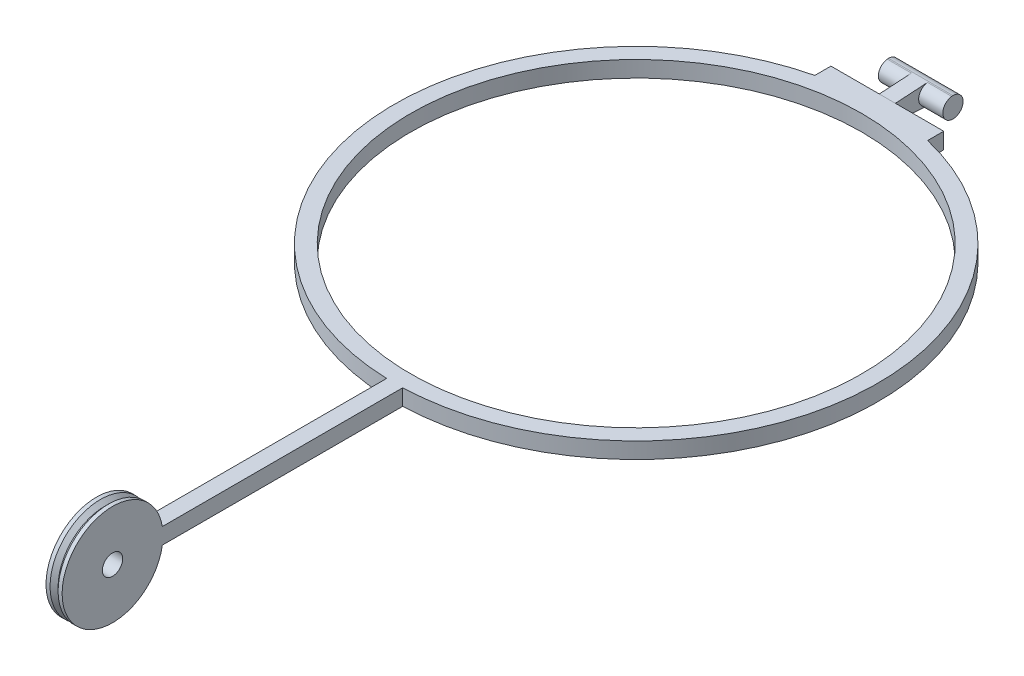
ISO-10303-21;
HEADER;
FILE_DESCRIPTION(('STEP AP214'),'2;1');
FILE_NAME('part.step','',(''),(''),'','','');
FILE_SCHEMA(('AUTOMOTIVE_DESIGN { 1 0 10303 214 1 1 1 1 }'));
ENDSEC;
DATA;
#1=APPLICATION_CONTEXT('core data for automotive mechanical design processes');
#2=APPLICATION_PROTOCOL_DEFINITION('international standard','automotive_design',2000,#1);
#3=PRODUCT_CONTEXT('',#1,'mechanical');
#4=PRODUCT('Part','Part','',(#3));
#5=PRODUCT_RELATED_PRODUCT_CATEGORY('part','',(#4));
#6=PRODUCT_DEFINITION_FORMATION('','',#4);
#7=PRODUCT_DEFINITION_CONTEXT('part definition',#1,'design');
#8=PRODUCT_DEFINITION('design','',#6,#7);
#9=PRODUCT_DEFINITION_SHAPE('','',#8);
#10=(LENGTH_UNIT() NAMED_UNIT(*) SI_UNIT(.MILLI.,.METRE.));
#11=(NAMED_UNIT(*) PLANE_ANGLE_UNIT() SI_UNIT($,.RADIAN.));
#12=(NAMED_UNIT(*) SI_UNIT($,.STERADIAN.) SOLID_ANGLE_UNIT());
#13=UNCERTAINTY_MEASURE_WITH_UNIT(LENGTH_MEASURE(1.E-05),#10,'distance_accuracy_value','');
#14=(GEOMETRIC_REPRESENTATION_CONTEXT(3) GLOBAL_UNCERTAINTY_ASSIGNED_CONTEXT((#13)) GLOBAL_UNIT_ASSIGNED_CONTEXT((#10,
#11,#12)) REPRESENTATION_CONTEXT('',''));
#15=CARTESIAN_POINT('',(0.,0.,0.));
#16=DIRECTION('',(0.,0.,1.));
#17=DIRECTION('',(1.,0.,0.));
#18=AXIS2_PLACEMENT_3D('',#15,#16,#17);
#19=CARTESIAN_POINT('',(0.,3.175,-308.520796125924));
#20=DIRECTION('',(0.,0.,-1.));
#21=DIRECTION('',(0.,1.,0.));
#22=AXIS2_PLACEMENT_3D('',#19,#20,#21);
#23=PLANE('',#22);
#24=DIRECTION('',(1.,0.,0.));
#25=VECTOR('',#24,1.);
#26=CARTESIAN_POINT('',(0.,3.175,-308.520796125924));
#27=LINE('',#26,#25);
#28=CARTESIAN_POINT('',(-19.05,3.175,-308.520796125924));
#29=VERTEX_POINT('',#28);
#30=CARTESIAN_POINT('',(0.,3.175,-308.520796125924));
#31=VERTEX_POINT('',#30);
#32=EDGE_CURVE('E253',#29,#31,#27,.T.);
#33=ORIENTED_EDGE('',*,*,#32,.T.);
#34=DIRECTION('',(0.,-1.,0.));
#35=VECTOR('',#34,1.);
#36=CARTESIAN_POINT('',(0.,0.,-308.520796125924));
#37=LINE('',#36,#35);
#38=CARTESIAN_POINT('',(0.,-3.175,-308.520796125924));
#39=VERTEX_POINT('',#38);
#40=EDGE_CURVE('E227',#31,#39,#37,.T.);
#41=ORIENTED_EDGE('',*,*,#40,.T.);
#42=DIRECTION('',(1.,0.,0.));
#43=VECTOR('',#42,1.);
#44=CARTESIAN_POINT('',(0.,-3.175,-308.520796125924));
#45=LINE('',#44,#43);
#46=CARTESIAN_POINT('',(-19.05,-3.175,-308.520796125924));
#47=VERTEX_POINT('',#46);
#48=EDGE_CURVE('E272',#47,#39,#45,.T.);
#49=ORIENTED_EDGE('',*,*,#48,.F.);
#50=DIRECTION('',(0.,-1.,0.));
#51=VECTOR('',#50,1.);
#52=CARTESIAN_POINT('',(-19.05,3.175,-308.520796125924));
#53=LINE('',#52,#51);
#54=EDGE_CURVE('E291',#29,#47,#53,.T.);
#55=ORIENTED_EDGE('',*,*,#54,.F.);
#56=EDGE_LOOP('',(#33,#41,#49,#55));
#57=FACE_BOUND('',#56,.T.);
#58=ADVANCED_FACE('F41',(#57),#23,.T.);
#59=CARTESIAN_POINT('',(0.,4.,0.));
#60=DIRECTION('',(1.,0.,0.));
#61=DIRECTION('',(0.,0.,-1.));
#62=AXIS2_PLACEMENT_3D('',#59,#60,#61);
#63=PLANE('',#62);
#64=DIRECTION('',(0.,0.,-1.));
#65=VECTOR('',#64,1.);
#66=CARTESIAN_POINT('',(0.,3.175,-20.0280685851132));
#67=LINE('',#66,#65);
#68=CARTESIAN_POINT('',(0.,3.175,-20.0280685851132));
#69=VERTEX_POINT('',#68);
#70=CARTESIAN_POINT('',(0.,3.175,-114.352931373913));
#71=VERTEX_POINT('',#70);
#72=EDGE_CURVE('E300',#69,#71,#67,.T.);
#73=ORIENTED_EDGE('',*,*,#72,.T.);
#74=DIRECTION('',(0.,-1.,0.));
#75=VECTOR('',#74,1.);
#76=CARTESIAN_POINT('',(0.,3.175,-114.352931373913));
#77=LINE('',#76,#75);
#78=CARTESIAN_POINT('',(0.,-3.175,-114.352931373913));
#79=VERTEX_POINT('',#78);
#80=EDGE_CURVE('E265',#71,#79,#77,.T.);
#81=ORIENTED_EDGE('',*,*,#80,.T.);
#82=DIRECTION('',(0.,0.,1.));
#83=VECTOR('',#82,1.);
#84=CARTESIAN_POINT('',(0.,-3.175,-20.0280685851132));
#85=LINE('',#84,#83);
#86=CARTESIAN_POINT('',(0.,-3.175,-20.0280685851132));
#87=VERTEX_POINT('',#86);
#88=EDGE_CURVE('E296',#79,#87,#85,.T.);
#89=ORIENTED_EDGE('',*,*,#88,.T.);
#90=CARTESIAN_POINT('',(0.,-5.715,-20.0280685851132));
#91=DIRECTION('',(1.,0.,0.));
#92=DIRECTION('',(0.,0.,-1.));
#93=AXIS2_PLACEMENT_3D('',#90,#91,#92);
#94=CIRCLE('',#93,2.54);
#95=CARTESIAN_POINT('',(0.,-3.20893847135261,-19.6142381673894));
#96=VERTEX_POINT('',#95);
#97=EDGE_CURVE('E299',#87,#96,#94,.T.);
#98=ORIENTED_EDGE('',*,*,#97,.T.);
#99=CARTESIAN_POINT('',(0.,0.,0.));
#100=DIRECTION('',(-1.,0.,0.));
#101=DIRECTION('',(0.,0.,1.));
#102=AXIS2_PLACEMENT_3D('',#99,#100,#101);
#103=CIRCLE('',#102,19.875);
#104=CARTESIAN_POINT('',(0.,3.20893847135261,-19.6142381673894));
#105=VERTEX_POINT('',#104);
#106=EDGE_CURVE('E11',#96,#105,#103,.T.);
#107=ORIENTED_EDGE('',*,*,#106,.T.);
#108=CARTESIAN_POINT('',(0.,5.715,-20.0280685851132));
#109=DIRECTION('',(1.,0.,0.));
#110=DIRECTION('',(0.,0.,-1.));
#111=AXIS2_PLACEMENT_3D('',#108,#109,#110);
#112=CIRCLE('',#111,2.54);
#113=EDGE_CURVE('E302',#105,#69,#112,.T.);
#114=ORIENTED_EDGE('',*,*,#113,.T.);
#115=EDGE_LOOP('',(#73,#81,#89,#98,#107,#114));
#116=FACE_BOUND('',#115,.T.);
#117=CARTESIAN_POINT('',(0.,0.,0.));
#118=DIRECTION('',(-1.,0.,0.));
#119=DIRECTION('',(0.,0.,1.));
#120=AXIS2_PLACEMENT_3D('',#117,#118,#119);
#121=CIRCLE('',#120,4.);
#122=CARTESIAN_POINT('',(0.,0.,4.));
#123=VERTEX_POINT('',#122);
#124=EDGE_CURVE('E650',#123,#123,#121,.T.);
#125=ORIENTED_EDGE('',*,*,#124,.F.);
#126=EDGE_LOOP('',(#125));
#127=FACE_BOUND('',#126,.T.);
#128=ADVANCED_FACE('F43',(#116,#127),#63,.F.);
#129=CARTESIAN_POINT('',(0.,0.,0.));
#130=DIRECTION('',(-1.,0.,0.));
#131=DIRECTION('',(0.,0.,1.));
#132=AXIS2_PLACEMENT_3D('',#129,#130,#131);
#133=CYLINDRICAL_SURFACE('',#132,19.875);
#134=CARTESIAN_POINT('',(1.5875,0.,0.));
#135=DIRECTION('',(-1.,0.,0.));
#136=DIRECTION('',(0.,0.,1.));
#137=AXIS2_PLACEMENT_3D('',#134,#135,#136);
#138=CIRCLE('',#137,19.875);
#139=CARTESIAN_POINT('',(1.5875,-3.20893847135261,-19.6142381673894));
#140=VERTEX_POINT('',#139);
#141=CARTESIAN_POINT('',(1.5875,3.20893847135261,-19.6142381673894));
#142=VERTEX_POINT('',#141);
#143=EDGE_CURVE('E49',#140,#142,#138,.T.);
#144=ORIENTED_EDGE('',*,*,#143,.T.);
#145=DIRECTION('',(1.,0.,0.));
#146=VECTOR('',#145,1.);
#147=CARTESIAN_POINT('',(0.793749999999982,3.20893847135262,-19.6142381673893));
#148=LINE('',#147,#146);
#149=EDGE_CURVE('E652',#142,#105,#148,.F.);
#150=ORIENTED_EDGE('',*,*,#149,.T.);
#151=ORIENTED_EDGE('',*,*,#106,.F.);
#152=DIRECTION('',(1.,0.,0.));
#153=VECTOR('',#152,1.);
#154=CARTESIAN_POINT('',(3.17499999999998,-3.20893847135262,-19.6142381673893));
#155=LINE('',#154,#153);
#156=EDGE_CURVE('E467',#96,#140,#155,.T.);
#157=ORIENTED_EDGE('',*,*,#156,.T.);
#158=EDGE_LOOP('',(#144,#150,#151,#157));
#159=FACE_BOUND('',#158,.T.);
#160=ADVANCED_FACE('F373',(#159),#133,.T.);
#161=CARTESIAN_POINT('',(3.175,0.,0.));
#162=DIRECTION('',(-1.,0.,0.));
#163=DIRECTION('',(0.,0.,1.));
#164=AXIS2_PLACEMENT_3D('',#161,#162,#163);
#165=CONICAL_SURFACE('',#164,18.2875,0.785398163397448);
#166=CARTESIAN_POINT('',(3.175,0.,0.));
#167=DIRECTION('',(-1.,0.,0.));
#168=DIRECTION('',(0.,0.,1.));
#169=AXIS2_PLACEMENT_3D('',#166,#167,#168);
#170=CIRCLE('',#169,18.2875);
#171=CARTESIAN_POINT('',(3.175,-5.01803204897371,-17.5855625615296));
#172=VERTEX_POINT('',#171);
#173=CARTESIAN_POINT('',(3.175,5.01803204897371,-17.5855625615296));
#174=VERTEX_POINT('',#173);
#175=EDGE_CURVE('E640',#172,#174,#170,.T.);
#176=ORIENTED_EDGE('',*,*,#175,.T.);
#177=CARTESIAN_POINT('',(3.17499999030238,5.01823204897371,-17.585505500478));
#178=CARTESIAN_POINT('',(3.17502405515739,4.96513618649698,-17.6006356701795));
#179=CARTESIAN_POINT('',(3.17296089600134,4.91255559256466,-17.6175221345397));
#180=CARTESIAN_POINT('',(3.16480610051195,4.80892936765385,-17.6545397430293));
#181=CARTESIAN_POINT('',(3.15871865600897,4.75788219719122,-17.6746674944415));
#182=CARTESIAN_POINT('',(3.14274309919891,4.65822882268911,-17.7177103141274));
#183=CARTESIAN_POINT('',(3.13289462486999,4.60960294712521,-17.7405946638421));
#184=CARTESIAN_POINT('',(3.10964646107507,4.51457204950013,-17.7890017680711));
#185=CARTESIAN_POINT('',(3.09624605896725,4.46816747531848,-17.8145250514211));
#186=CARTESIAN_POINT('',(3.05126307810561,4.33304093969769,-17.8943677162299));
#187=CARTESIAN_POINT('',(3.0148181643232,4.24793131662126,-17.952168709759));
#188=CARTESIAN_POINT('',(2.93146283418181,4.08836313877495,-18.074652604436));
#189=CARTESIAN_POINT('',(2.88452632582482,4.0139319116988,-18.1393524491193));
#190=CARTESIAN_POINT('',(2.75767222998424,3.84203466522822,-18.3063975643941));
#191=CARTESIAN_POINT('',(2.67284229921008,3.75107146949168,-18.4116964341903));
#192=CARTESIAN_POINT('',(2.49109010255667,3.59090685984091,-18.6287352687228));
#193=CARTESIAN_POINT('',(2.39411912413202,3.52179730483181,-18.7405001457703));
#194=CARTESIAN_POINT('',(2.23767172921667,3.4301026851174,-18.9164017767731));
#195=CARTESIAN_POINT('',(2.18087601166023,3.40055014229437,-18.9794274730799));
#196=CARTESIAN_POINT('',(2.06535959967588,3.34719880562968,-19.1061957826569));
#197=CARTESIAN_POINT('',(2.00663835520765,3.32340167241029,-19.1699385973004));
#198=CARTESIAN_POINT('',(1.88841206153367,3.28154848838009,-19.297081015349));
#199=CARTESIAN_POINT('',(1.82892434681642,3.26342822324976,-19.3604758416092));
#200=CARTESIAN_POINT('',(1.70886171194385,3.23235412302284,-19.4873996966121));
#201=CARTESIAN_POINT('',(1.6482877646825,3.21939588453877,-19.5509285642997));
#202=CARTESIAN_POINT('',(1.5873,3.20890408587936,-19.614446451726));
#203=B_SPLINE_CURVE_WITH_KNOTS('',3,(#177,#178,#179,#180,#181,#182,#183,#184,#185,#186,#187,
#188,#189,#190,#191,#192,#193,#194,#195,#196,#197,#198,#199,#200,#201,#202),.UNSPECIFIED.,.F.,
.F.,(4,2,2,2,2,2,2,2,2,2,2,2,4),(0.,0.16553756777862,0.330902977201613,0.494571639970082,
0.658273165325804,0.984123147386781,1.31079269860429,1.7969984258337,2.28522149433629,
2.55456455237631,2.82398523215425,3.09023803031959,3.35626321675944),.UNSPECIFIED.);
#204=EDGE_CURVE('E469',#174,#142,#203,.T.);
#205=ORIENTED_EDGE('',*,*,#204,.T.);
#206=ORIENTED_EDGE('',*,*,#143,.F.);
#207=CARTESIAN_POINT('',(1.5873,-3.20890408587936,-19.614446451726));
#208=CARTESIAN_POINT('',(1.66064982255872,-3.22153110320836,-19.5380493496869));
#209=CARTESIAN_POINT('',(1.73341544587569,-3.2377170047899,-19.4616274158475));
#210=CARTESIAN_POINT('',(1.87735680631515,-3.27763445448927,-19.3089632312623));
#211=CARTESIAN_POINT('',(1.94852901729398,-3.30138124886678,-19.2327216598923));
#212=CARTESIAN_POINT('',(2.08942775207854,-3.35714382145323,-19.0800200198884));
#213=CARTESIAN_POINT('',(2.1591254139806,-3.38925846448253,-19.0035689605965));
#214=CARTESIAN_POINT('',(2.29528140739618,-3.46209781161551,-18.8520179020321));
#215=CARTESIAN_POINT('',(2.36174256784133,-3.50281482416876,-18.7769167604303));
#216=CARTESIAN_POINT('',(2.51043549991202,-3.6075253388356,-18.6057083746238));
#217=CARTESIAN_POINT('',(2.59118706302345,-3.67482300906941,-18.5102885579029));
#218=CARTESIAN_POINT('',(2.74217595977378,-3.82649561009981,-18.325310932763));
#219=CARTESIAN_POINT('',(2.81244950551055,-3.9108092375638,-18.2357335666822));
#220=CARTESIAN_POINT('',(2.92573787543575,-4.07879444820554,-18.0826607062241));
#221=CARTESIAN_POINT('',(2.97139237378838,-4.15918186846448,-18.0175438214527));
#222=CARTESIAN_POINT('',(3.05057098196331,-4.3312212360454,-17.8955062987592));
#223=CARTESIAN_POINT('',(3.08412423957324,-4.42284539409008,-17.8385661678185));
#224=CARTESIAN_POINT('',(3.13128251989571,-4.59699168588081,-17.7456609120086));
#225=CARTESIAN_POINT('',(3.14751177696336,-4.67776466006227,-17.7077727794117));
#226=CARTESIAN_POINT('',(3.16392090672709,-4.80272909923509,-17.6571177824549));
#227=CARTESIAN_POINT('',(3.16806858884479,-4.84517225548812,-17.6412179540781));
#228=CARTESIAN_POINT('',(3.1736139792659,-4.93103517639737,-17.6116526039692));
#229=CARTESIAN_POINT('',(3.17500995184232,-4.97445554000634,-17.5979884974679));
#230=CARTESIAN_POINT('',(3.17499999030238,-5.01823204897372,-17.585505500478));
#231=B_SPLINE_CURVE_WITH_KNOTS('',3,(#207,#208,#209,#210,#211,#212,#213,#214,#215,#216,#217,
#218,#219,#220,#221,#222,#223,#224,#225,#226,#227,#228,#229,#230),.UNSPECIFIED.,.F.,.F.,(4,2,2,
2,2,2,2,2,2,2,2,4),(0.,0.319970667702856,0.640590674709486,0.965185565257763,1.28949144808107,
1.714104534021,2.13721433282405,2.47519183204377,2.8123497337721,3.08325745561008,
3.21966259573286,3.35615375017256),.UNSPECIFIED.);
#232=EDGE_CURVE('E329',#140,#172,#231,.T.);
#233=ORIENTED_EDGE('',*,*,#232,.T.);
#234=EDGE_LOOP('',(#176,#205,#206,#233));
#235=FACE_BOUND('',#234,.T.);
#236=ADVANCED_FACE('F362',(#235),#165,.T.);
#237=CARTESIAN_POINT('',(4.7625,0.,0.));
#238=DIRECTION('',(1.,0.,0.));
#239=DIRECTION('',(0.,0.,-1.));
#240=AXIS2_PLACEMENT_3D('',#237,#238,#239);
#241=CONICAL_SURFACE('',#240,19.875,0.785398163397448);
#242=CARTESIAN_POINT('',(4.7625,0.,0.));
#243=DIRECTION('',(-1.,0.,0.));
#244=DIRECTION('',(0.,0.,1.));
#245=AXIS2_PLACEMENT_3D('',#242,#243,#244);
#246=CIRCLE('',#245,19.875);
#247=CARTESIAN_POINT('',(4.7625,-3.20893847135261,-19.6142381673894));
#248=VERTEX_POINT('',#247);
#249=CARTESIAN_POINT('',(4.7625,3.20893847135261,-19.6142381673894));
#250=VERTEX_POINT('',#249);
#251=EDGE_CURVE('E641',#248,#250,#246,.T.);
#252=ORIENTED_EDGE('',*,*,#251,.T.);
#253=CARTESIAN_POINT('',(4.7627,3.20890408587936,-19.614446451726));
#254=CARTESIAN_POINT('',(4.68935017744128,3.22153110320836,-19.5380493496868));
#255=CARTESIAN_POINT('',(4.61658455412431,3.2377170047899,-19.4616274158475));
#256=CARTESIAN_POINT('',(4.47264319368485,3.27763445448927,-19.3089632312623));
#257=CARTESIAN_POINT('',(4.40147098270601,3.30138124886678,-19.2327216598923));
#258=CARTESIAN_POINT('',(4.26057224792145,3.35714382145323,-19.0800200198884));
#259=CARTESIAN_POINT('',(4.19087458601939,3.38925846448253,-19.0035689605965));
#260=CARTESIAN_POINT('',(4.05471859260382,3.46209781161551,-18.8520179020321));
#261=CARTESIAN_POINT('',(3.98825743215867,3.50281482416876,-18.7769167604303));
#262=CARTESIAN_POINT('',(3.83956450008798,3.6075253388356,-18.6057083746238));
#263=CARTESIAN_POINT('',(3.75881293697655,3.67482300906941,-18.5102885579029));
#264=CARTESIAN_POINT('',(3.60782404022622,3.82649561009981,-18.325310932763));
#265=CARTESIAN_POINT('',(3.53755049448945,3.9108092375638,-18.2357335666822));
#266=CARTESIAN_POINT('',(3.42426212456425,4.07879444820554,-18.0826607062241));
#267=CARTESIAN_POINT('',(3.37860762621162,4.15918186846448,-18.0175438214527));
#268=CARTESIAN_POINT('',(3.29942901803669,4.3312212360454,-17.8955062987592));
#269=CARTESIAN_POINT('',(3.26587576042676,4.42284539409008,-17.8385661678185));
#270=CARTESIAN_POINT('',(3.21871748010429,4.59699168588081,-17.7456609120086));
#271=CARTESIAN_POINT('',(3.20248822303664,4.67776466006227,-17.7077727794117));
#272=CARTESIAN_POINT('',(3.18607909327291,4.80272909923508,-17.6571177824549));
#273=CARTESIAN_POINT('',(3.18193141115521,4.84517225548811,-17.6412179540781));
#274=CARTESIAN_POINT('',(3.1763860207341,4.93103517639736,-17.6116526039692));
#275=CARTESIAN_POINT('',(3.17499004815768,4.97445554000633,-17.5979884974679));
#276=CARTESIAN_POINT('',(3.17500000969762,5.01823204897371,-17.585505500478));
#277=B_SPLINE_CURVE_WITH_KNOTS('',3,(#253,#254,#255,#256,#257,#258,#259,#260,#261,#262,#263,
#264,#265,#266,#267,#268,#269,#270,#271,#272,#273,#274,#275,#276),.UNSPECIFIED.,.F.,.F.,(4,2,2,
2,2,2,2,2,2,2,2,4),(0.,0.31997066770286,0.640590674709487,0.965185565257763,1.28949144808107,
1.714104534021,2.13721433282405,2.47519183204377,2.8123497337721,3.08325745561007,
3.21966259573285,3.35615375017255),.UNSPECIFIED.);
#278=EDGE_CURVE('E464',#250,#174,#277,.T.);
#279=ORIENTED_EDGE('',*,*,#278,.T.);
#280=ORIENTED_EDGE('',*,*,#175,.F.);
#281=CARTESIAN_POINT('',(3.17500000969762,-5.01823204897372,-17.585505500478));
#282=CARTESIAN_POINT('',(3.17497594484261,-4.96513618649699,-17.6006356701795));
#283=CARTESIAN_POINT('',(3.17703910399866,-4.91255559256467,-17.6175221345397));
#284=CARTESIAN_POINT('',(3.18519389948805,-4.80892936765387,-17.6545397430293));
#285=CARTESIAN_POINT('',(3.19128134399103,-4.75788219719123,-17.6746674944415));
#286=CARTESIAN_POINT('',(3.20725690080108,-4.65822882268912,-17.7177103141274));
#287=CARTESIAN_POINT('',(3.21710537513,-4.60960294712522,-17.740594663842));
#288=CARTESIAN_POINT('',(3.24035353892493,-4.51457204950014,-17.7890017680711));
#289=CARTESIAN_POINT('',(3.25375394103275,-4.46816747531849,-17.8145250514211));
#290=CARTESIAN_POINT('',(3.29873692189438,-4.3330409396977,-17.8943677162299));
#291=CARTESIAN_POINT('',(3.33518183567679,-4.24793131662127,-17.952168709759));
#292=CARTESIAN_POINT('',(3.41853716581818,-4.08836313877497,-18.074652604436));
#293=CARTESIAN_POINT('',(3.46547367417518,-4.0139319116988,-18.1393524491192));
#294=CARTESIAN_POINT('',(3.59232777001575,-3.84203466522823,-18.3063975643941));
#295=CARTESIAN_POINT('',(3.67715770078991,-3.75107146949169,-18.4116964341902));
#296=CARTESIAN_POINT('',(3.85890989744331,-3.59090685984092,-18.6287352687228));
#297=CARTESIAN_POINT('',(3.95588087586797,-3.52179730483182,-18.7405001457702));
#298=CARTESIAN_POINT('',(4.11232827078332,-3.43010268511741,-18.916401776773));
#299=CARTESIAN_POINT('',(4.16912398833976,-3.40055014229437,-18.9794274730799));
#300=CARTESIAN_POINT('',(4.2846404003241,-3.34719880562969,-19.1061957826569));
#301=CARTESIAN_POINT('',(4.34336164479234,-3.3234016724103,-19.1699385973003));
#302=CARTESIAN_POINT('',(4.46158793846633,-3.28154848838009,-19.297081015349));
#303=CARTESIAN_POINT('',(4.52107565318358,-3.26342822324976,-19.3604758416092));
#304=CARTESIAN_POINT('',(4.64113828805615,-3.23235412302284,-19.4873996966121));
#305=CARTESIAN_POINT('',(4.7017122353175,-3.21939588453877,-19.5509285642997));
#306=CARTESIAN_POINT('',(4.7627,-3.20890408587936,-19.614446451726));
#307=B_SPLINE_CURVE_WITH_KNOTS('',3,(#281,#282,#283,#284,#285,#286,#287,#288,#289,#290,#291,
#292,#293,#294,#295,#296,#297,#298,#299,#300,#301,#302,#303,#304,#305,#306),.UNSPECIFIED.,.F.,
.F.,(4,2,2,2,2,2,2,2,2,2,2,2,4),(0.,0.165537567778618,0.330902977201611,0.494571639970078,
0.658273165325801,0.984123147386778,1.31079269860428,1.7969984258337,2.28522149433628,
2.5545645523763,2.82398523215425,3.0902380303196,3.35626321675945),.UNSPECIFIED.);
#308=EDGE_CURVE('E321',#172,#248,#307,.T.);
#309=ORIENTED_EDGE('',*,*,#308,.T.);
#310=EDGE_LOOP('',(#252,#279,#280,#309));
#311=FACE_BOUND('',#310,.T.);
#312=ADVANCED_FACE('F336',(#311),#241,.T.);
#313=CARTESIAN_POINT('',(0.,0.,0.));
#314=DIRECTION('',(-1.,0.,0.));
#315=DIRECTION('',(0.,0.,1.));
#316=AXIS2_PLACEMENT_3D('',#313,#314,#315);
#317=CYLINDRICAL_SURFACE('',#316,19.875);
#318=CARTESIAN_POINT('',(6.35,0.,0.));
#319=DIRECTION('',(-1.,0.,0.));
#320=DIRECTION('',(0.,0.,1.));
#321=AXIS2_PLACEMENT_3D('',#318,#319,#320);
#322=CIRCLE('',#321,19.875);
#323=CARTESIAN_POINT('',(6.35,-3.20893847135262,-19.6142381673893));
#324=VERTEX_POINT('',#323);
#325=CARTESIAN_POINT('',(6.35000000000002,3.20893847135263,-19.6142381673893));
#326=VERTEX_POINT('',#325);
#327=EDGE_CURVE('E645',#324,#326,#322,.T.);
#328=ORIENTED_EDGE('',*,*,#327,.T.);
#329=DIRECTION('',(1.,0.,0.));
#330=VECTOR('',#329,1.);
#331=CARTESIAN_POINT('',(3.17499999999998,3.20893847135262,-19.6142381673893));
#332=LINE('',#331,#330);
#333=EDGE_CURVE('E462',#326,#250,#332,.F.);
#334=ORIENTED_EDGE('',*,*,#333,.T.);
#335=ORIENTED_EDGE('',*,*,#251,.F.);
#336=DIRECTION('',(1.,0.,0.));
#337=VECTOR('',#336,1.);
#338=CARTESIAN_POINT('',(3.17499999999998,-3.20893847135262,-19.6142381673893));
#339=LINE('',#338,#337);
#340=EDGE_CURVE('E298',#248,#324,#339,.T.);
#341=ORIENTED_EDGE('',*,*,#340,.T.);
#342=EDGE_LOOP('',(#328,#334,#335,#341));
#343=FACE_BOUND('',#342,.T.);
#344=ADVANCED_FACE('F355',(#343),#317,.T.);
#345=CARTESIAN_POINT('',(6.35,19.875,0.));
#346=DIRECTION('',(-1.,0.,0.));
#347=DIRECTION('',(0.,0.,1.));
#348=AXIS2_PLACEMENT_3D('',#345,#346,#347);
#349=PLANE('',#348);
#350=DIRECTION('',(0.,0.,-1.));
#351=VECTOR('',#350,1.);
#352=CARTESIAN_POINT('',(6.35,-3.175,-20.0280685851132));
#353=LINE('',#352,#351);
#354=CARTESIAN_POINT('',(6.35,-3.175,-20.0280685851132));
#355=VERTEX_POINT('',#354);
#356=CARTESIAN_POINT('',(6.35,-3.175,-114.352931373913));
#357=VERTEX_POINT('',#356);
#358=EDGE_CURVE('E64',#355,#357,#353,.T.);
#359=ORIENTED_EDGE('',*,*,#358,.T.);
#360=DIRECTION('',(0.,-1.,0.));
#361=VECTOR('',#360,1.);
#362=CARTESIAN_POINT('',(6.35,3.175,-114.352931373913));
#363=LINE('',#362,#361);
#364=CARTESIAN_POINT('',(6.35,3.175,-114.352931373913));
#365=VERTEX_POINT('',#364);
#366=EDGE_CURVE('E283',#365,#357,#363,.T.);
#367=ORIENTED_EDGE('',*,*,#366,.F.);
#368=DIRECTION('',(0.,0.,1.));
#369=VECTOR('',#368,1.);
#370=CARTESIAN_POINT('',(6.35,3.175,-20.0280685851132));
#371=LINE('',#370,#369);
#372=CARTESIAN_POINT('',(6.35,3.175,-20.0280685851132));
#373=VERTEX_POINT('',#372);
#374=EDGE_CURVE('E309',#365,#373,#371,.T.);
#375=ORIENTED_EDGE('',*,*,#374,.T.);
#376=CARTESIAN_POINT('',(6.35,5.715,-20.0280685851132));
#377=DIRECTION('',(-1.,0.,0.));
#378=DIRECTION('',(0.,0.,1.));
#379=AXIS2_PLACEMENT_3D('',#376,#377,#378);
#380=CIRCLE('',#379,2.54);
#381=EDGE_CURVE('E311',#373,#326,#380,.T.);
#382=ORIENTED_EDGE('',*,*,#381,.T.);
#383=ORIENTED_EDGE('',*,*,#327,.F.);
#384=CARTESIAN_POINT('',(6.35,-5.715,-20.0280685851132));
#385=DIRECTION('',(-1.,0.,0.));
#386=DIRECTION('',(0.,0.,-1.));
#387=AXIS2_PLACEMENT_3D('',#384,#385,#386);
#388=CIRCLE('',#387,2.54);
#389=EDGE_CURVE('E285',#324,#355,#388,.T.);
#390=ORIENTED_EDGE('',*,*,#389,.T.);
#391=EDGE_LOOP('',(#359,#367,#375,#382,#383,#390));
#392=FACE_BOUND('',#391,.T.);
#393=CARTESIAN_POINT('',(6.35,0.,0.));
#394=DIRECTION('',(-1.,0.,0.));
#395=DIRECTION('',(0.,0.,1.));
#396=AXIS2_PLACEMENT_3D('',#393,#394,#395);
#397=CIRCLE('',#396,4.);
#398=CARTESIAN_POINT('',(6.35,0.,4.));
#399=VERTEX_POINT('',#398);
#400=EDGE_CURVE('E647',#399,#399,#397,.T.);
#401=ORIENTED_EDGE('',*,*,#400,.T.);
#402=EDGE_LOOP('',(#401));
#403=FACE_BOUND('',#402,.T.);
#404=ADVANCED_FACE('F352',(#392,#403),#349,.F.);
#405=CARTESIAN_POINT('',(0.,0.,0.));
#406=DIRECTION('',(-1.,0.,0.));
#407=DIRECTION('',(0.,0.,1.));
#408=AXIS2_PLACEMENT_3D('',#405,#406,#407);
#409=CYLINDRICAL_SURFACE('',#408,4.);
#410=ORIENTED_EDGE('',*,*,#400,.F.);
#411=EDGE_LOOP('',(#410));
#412=FACE_BOUND('',#411,.T.);
#413=ORIENTED_EDGE('',*,*,#124,.T.);
#414=EDGE_LOOP('',(#413));
#415=FACE_BOUND('',#414,.T.);
#416=ADVANCED_FACE('F348',(#412,#415),#409,.F.);
#417=CARTESIAN_POINT('',(-325.15113913571,5.715,-20.0280685851132));
#418=DIRECTION('',(1.,0.,0.));
#419=DIRECTION('',(0.,0.,-1.));
#420=AXIS2_PLACEMENT_3D('',#417,#418,#419);
#421=CYLINDRICAL_SURFACE('',#420,2.54);
#422=ORIENTED_EDGE('',*,*,#149,.F.);
#423=ORIENTED_EDGE('',*,*,#204,.F.);
#424=ORIENTED_EDGE('',*,*,#278,.F.);
#425=ORIENTED_EDGE('',*,*,#333,.F.);
#426=ORIENTED_EDGE('',*,*,#381,.F.);
#427=DIRECTION('',(1.,0.,0.));
#428=VECTOR('',#427,1.);
#429=CARTESIAN_POINT('',(-325.15113913571,3.175,-20.0280685851132));
#430=LINE('',#429,#428);
#431=EDGE_CURVE('E303',#69,#373,#430,.T.);
#432=ORIENTED_EDGE('',*,*,#431,.F.);
#433=ORIENTED_EDGE('',*,*,#113,.F.);
#434=EDGE_LOOP('',(#422,#423,#424,#425,#426,#432,#433));
#435=FACE_BOUND('',#434,.T.);
#436=ADVANCED_FACE('F345',(#435),#421,.F.);
#437=CARTESIAN_POINT('',(-325.15113913571,-5.715,-20.0280685851132));
#438=DIRECTION('',(1.,0.,0.));
#439=DIRECTION('',(0.,0.,-1.));
#440=AXIS2_PLACEMENT_3D('',#437,#438,#439);
#441=CYLINDRICAL_SURFACE('',#440,2.54);
#442=ORIENTED_EDGE('',*,*,#156,.F.);
#443=ORIENTED_EDGE('',*,*,#97,.F.);
#444=DIRECTION('',(1.,0.,0.));
#445=VECTOR('',#444,1.);
#446=CARTESIAN_POINT('',(-325.15113913571,-3.175,-20.0280685851132));
#447=LINE('',#446,#445);
#448=EDGE_CURVE('E314',#87,#355,#447,.T.);
#449=ORIENTED_EDGE('',*,*,#448,.T.);
#450=ORIENTED_EDGE('',*,*,#389,.F.);
#451=ORIENTED_EDGE('',*,*,#340,.F.);
#452=ORIENTED_EDGE('',*,*,#308,.F.);
#453=ORIENTED_EDGE('',*,*,#232,.F.);
#454=EDGE_LOOP('',(#442,#443,#449,#450,#451,#452,#453));
#455=FACE_BOUND('',#454,.T.);
#456=ADVANCED_FACE('F339',(#455),#441,.F.);
#457=CARTESIAN_POINT('',(-325.15113913571,-3.175,-20.0280685851132));
#458=DIRECTION('',(0.,-1.,0.));
#459=DIRECTION('',(0.,0.,-1.));
#460=AXIS2_PLACEMENT_3D('',#457,#458,#459);
#461=PLANE('',#460);
#462=CARTESIAN_POINT('',(3.175,-3.175,-209.55));
#463=DIRECTION('',(0.,-1.,0.));
#464=DIRECTION('',(0.,0.,-1.));
#465=AXIS2_PLACEMENT_3D('',#462,#463,#464);
#466=CIRCLE('',#465,88.9);
#467=CARTESIAN_POINT('',(3.175,-3.175,-298.45));
#468=VERTEX_POINT('',#467);
#469=EDGE_CURVE('E249',#468,#468,#466,.T.);
#470=ORIENTED_EDGE('',*,*,#469,.F.);
#471=EDGE_LOOP('',(#470));
#472=FACE_BOUND('',#471,.T.);
#473=ORIENTED_EDGE('',*,*,#88,.F.);
#474=CARTESIAN_POINT('',(3.175,-3.175,-209.55));
#475=DIRECTION('',(0.,-1.,0.));
#476=DIRECTION('',(0.,0.,-1.));
#477=AXIS2_PLACEMENT_3D('',#474,#475,#476);
#478=CIRCLE('',#477,95.25);
#479=CARTESIAN_POINT('',(-19.05,-3.175,-302.170796125924));
#480=VERTEX_POINT('',#479);
#481=EDGE_CURVE('E244',#79,#480,#478,.T.);
#482=ORIENTED_EDGE('',*,*,#481,.T.);
#483=DIRECTION('',(0.,0.,-1.));
#484=VECTOR('',#483,1.);
#485=CARTESIAN_POINT('',(-19.0500000000002,-3.175,0.));
#486=LINE('',#485,#484);
#487=EDGE_CURVE('E268',#480,#47,#486,.T.);
#488=ORIENTED_EDGE('',*,*,#487,.T.);
#489=ORIENTED_EDGE('',*,*,#48,.T.);
#490=DIRECTION('',(1.,0.,0.));
#491=VECTOR('',#490,1.);
#492=CARTESIAN_POINT('',(0.,-3.175,-308.520796125924));
#493=LINE('',#492,#491);
#494=CARTESIAN_POINT('',(6.35,-3.175,-308.520796125924));
#495=VERTEX_POINT('',#494);
#496=EDGE_CURVE('E241',#39,#495,#493,.T.);
#497=ORIENTED_EDGE('',*,*,#496,.T.);
#498=CARTESIAN_POINT('',(25.4,-3.175,-308.520796125924));
#499=VERTEX_POINT('',#498);
#500=EDGE_CURVE('E271',#495,#499,#45,.T.);
#501=ORIENTED_EDGE('',*,*,#500,.T.);
#502=DIRECTION('',(0.,0.,1.));
#503=VECTOR('',#502,1.);
#504=CARTESIAN_POINT('',(25.4000000000002,-3.175,0.));
#505=LINE('',#504,#503);
#506=CARTESIAN_POINT('',(25.4,-3.175,-302.170796125924));
#507=VERTEX_POINT('',#506);
#508=EDGE_CURVE('E275',#499,#507,#505,.T.);
#509=ORIENTED_EDGE('',*,*,#508,.T.);
#510=CARTESIAN_POINT('',(3.175,-3.175,-209.55));
#511=DIRECTION('',(0.,-1.,0.));
#512=DIRECTION('',(0.,0.,-1.));
#513=AXIS2_PLACEMENT_3D('',#510,#511,#512);
#514=CIRCLE('',#513,95.25);
#515=EDGE_CURVE('E278',#507,#357,#514,.T.);
#516=ORIENTED_EDGE('',*,*,#515,.T.);
#517=ORIENTED_EDGE('',*,*,#358,.F.);
#518=ORIENTED_EDGE('',*,*,#448,.F.);
#519=EDGE_LOOP('',(#473,#482,#488,#489,#497,#501,#509,#516,#517,#518));
#520=FACE_BOUND('',#519,.T.);
#521=ADVANCED_FACE('F344',(#472,#520),#461,.T.);
#522=CARTESIAN_POINT('',(-325.15113913571,3.175,-20.0280685851132));
#523=DIRECTION('',(0.,1.,0.));
#524=DIRECTION('',(0.,0.,1.));
#525=AXIS2_PLACEMENT_3D('',#522,#523,#524);
#526=PLANE('',#525);
#527=CARTESIAN_POINT('',(3.175,3.175,-209.55));
#528=DIRECTION('',(0.,-1.,0.));
#529=DIRECTION('',(0.,0.,-1.));
#530=AXIS2_PLACEMENT_3D('',#527,#528,#529);
#531=CIRCLE('',#530,88.9);
#532=CARTESIAN_POINT('',(3.175,3.175,-298.45));
#533=VERTEX_POINT('',#532);
#534=EDGE_CURVE('E262',#533,#533,#531,.T.);
#535=ORIENTED_EDGE('',*,*,#534,.T.);
#536=EDGE_LOOP('',(#535));
#537=FACE_BOUND('',#536,.T.);
#538=ORIENTED_EDGE('',*,*,#72,.F.);
#539=ORIENTED_EDGE('',*,*,#431,.T.);
#540=ORIENTED_EDGE('',*,*,#374,.F.);
#541=CARTESIAN_POINT('',(3.175,3.175,-209.55));
#542=DIRECTION('',(0.,-1.,0.));
#543=DIRECTION('',(0.,0.,-1.));
#544=AXIS2_PLACEMENT_3D('',#541,#542,#543);
#545=CIRCLE('',#544,95.25);
#546=CARTESIAN_POINT('',(25.4,3.175,-302.170796125924));
#547=VERTEX_POINT('',#546);
#548=EDGE_CURVE('E259',#547,#365,#545,.T.);
#549=ORIENTED_EDGE('',*,*,#548,.F.);
#550=DIRECTION('',(0.,0.,1.));
#551=VECTOR('',#550,1.);
#552=CARTESIAN_POINT('',(25.4000000000002,3.175,0.));
#553=LINE('',#552,#551);
#554=CARTESIAN_POINT('',(25.4,3.175,-308.520796125924));
#555=VERTEX_POINT('',#554);
#556=EDGE_CURVE('E256',#555,#547,#553,.T.);
#557=ORIENTED_EDGE('',*,*,#556,.F.);
#558=CARTESIAN_POINT('',(6.35,3.175,-308.520796125924));
#559=VERTEX_POINT('',#558);
#560=EDGE_CURVE('E252',#559,#555,#27,.T.);
#561=ORIENTED_EDGE('',*,*,#560,.F.);
#562=DIRECTION('',(1.,0.,0.));
#563=VECTOR('',#562,1.);
#564=CARTESIAN_POINT('',(0.,3.175,-308.520796125924));
#565=LINE('',#564,#563);
#566=EDGE_CURVE('E232',#31,#559,#565,.T.);
#567=ORIENTED_EDGE('',*,*,#566,.F.);
#568=ORIENTED_EDGE('',*,*,#32,.F.);
#569=DIRECTION('',(0.,0.,-1.));
#570=VECTOR('',#569,1.);
#571=CARTESIAN_POINT('',(-19.0500000000002,3.175,0.));
#572=LINE('',#571,#570);
#573=CARTESIAN_POINT('',(-19.05,3.175,-302.170796125924));
#574=VERTEX_POINT('',#573);
#575=EDGE_CURVE('E248',#574,#29,#572,.T.);
#576=ORIENTED_EDGE('',*,*,#575,.F.);
#577=CARTESIAN_POINT('',(3.175,3.175,-209.55));
#578=DIRECTION('',(0.,-1.,0.));
#579=DIRECTION('',(0.,0.,-1.));
#580=AXIS2_PLACEMENT_3D('',#577,#578,#579);
#581=CIRCLE('',#580,95.25);
#582=EDGE_CURVE('E245',#71,#574,#581,.T.);
#583=ORIENTED_EDGE('',*,*,#582,.F.);
#584=EDGE_LOOP('',(#538,#539,#540,#549,#557,#561,#567,#568,#576,#583));
#585=FACE_BOUND('',#584,.T.);
#586=ADVANCED_FACE('F401',(#537,#585),#526,.T.);
#587=CARTESIAN_POINT('',(3.175,3.175,-209.55));
#588=DIRECTION('',(0.,-1.,0.));
#589=DIRECTION('',(0.,0.,-1.));
#590=AXIS2_PLACEMENT_3D('',#587,#588,#589);
#591=CYLINDRICAL_SURFACE('',#590,88.9);
#592=ORIENTED_EDGE('',*,*,#469,.T.);
#593=EDGE_LOOP('',(#592));
#594=FACE_BOUND('',#593,.T.);
#595=ORIENTED_EDGE('',*,*,#534,.F.);
#596=EDGE_LOOP('',(#595));
#597=FACE_BOUND('',#596,.T.);
#598=ADVANCED_FACE('F446',(#594,#597),#591,.F.);
#599=CARTESIAN_POINT('',(3.175,3.175,-209.55));
#600=DIRECTION('',(0.,-1.,0.));
#601=DIRECTION('',(0.,0.,-1.));
#602=AXIS2_PLACEMENT_3D('',#599,#600,#601);
#603=CYLINDRICAL_SURFACE('',#602,95.25);
#604=ORIENTED_EDGE('',*,*,#515,.F.);
#605=DIRECTION('',(0.,-1.,0.));
#606=VECTOR('',#605,1.);
#607=CARTESIAN_POINT('',(25.4,3.175,-302.170796125924));
#608=LINE('',#607,#606);
#609=EDGE_CURVE('E286',#547,#507,#608,.T.);
#610=ORIENTED_EDGE('',*,*,#609,.F.);
#611=ORIENTED_EDGE('',*,*,#548,.T.);
#612=ORIENTED_EDGE('',*,*,#366,.T.);
#613=EDGE_LOOP('',(#604,#610,#611,#612));
#614=FACE_BOUND('',#613,.T.);
#615=ADVANCED_FACE('F389',(#614),#603,.T.);
#616=CARTESIAN_POINT('',(25.4000000000002,3.175,0.));
#617=DIRECTION('',(1.,0.,0.));
#618=DIRECTION('',(0.,0.,-1.));
#619=AXIS2_PLACEMENT_3D('',#616,#617,#618);
#620=PLANE('',#619);
#621=ORIENTED_EDGE('',*,*,#508,.F.);
#622=DIRECTION('',(0.,-1.,0.));
#623=VECTOR('',#622,1.);
#624=CARTESIAN_POINT('',(25.4,3.175,-308.520796125924));
#625=LINE('',#624,#623);
#626=EDGE_CURVE('E288',#555,#499,#625,.T.);
#627=ORIENTED_EDGE('',*,*,#626,.F.);
#628=ORIENTED_EDGE('',*,*,#556,.T.);
#629=ORIENTED_EDGE('',*,*,#609,.T.);
#630=EDGE_LOOP('',(#621,#627,#628,#629));
#631=FACE_BOUND('',#630,.T.);
#632=ADVANCED_FACE('F379',(#631),#620,.T.);
#633=DIRECTION('',(0.,-1.,0.));
#634=VECTOR('',#633,1.);
#635=CARTESIAN_POINT('',(6.35,0.,-308.520796125924));
#636=LINE('',#635,#634);
#637=EDGE_CURVE('E236',#559,#495,#636,.T.);
#638=ORIENTED_EDGE('',*,*,#637,.F.);
#639=ORIENTED_EDGE('',*,*,#560,.T.);
#640=ORIENTED_EDGE('',*,*,#626,.T.);
#641=ORIENTED_EDGE('',*,*,#500,.F.);
#642=EDGE_LOOP('',(#638,#639,#640,#641));
#643=FACE_BOUND('',#642,.T.);
#644=ADVANCED_FACE('F367',(#643),#23,.T.);
#645=CARTESIAN_POINT('',(-19.0500000000002,3.175,0.));
#646=DIRECTION('',(-1.,0.,0.));
#647=DIRECTION('',(0.,0.,1.));
#648=AXIS2_PLACEMENT_3D('',#645,#646,#647);
#649=PLANE('',#648);
#650=ORIENTED_EDGE('',*,*,#487,.F.);
#651=DIRECTION('',(0.,-1.,0.));
#652=VECTOR('',#651,1.);
#653=CARTESIAN_POINT('',(-19.05,3.175,-302.170796125924));
#654=LINE('',#653,#652);
#655=EDGE_CURVE('E293',#574,#480,#654,.T.);
#656=ORIENTED_EDGE('',*,*,#655,.F.);
#657=ORIENTED_EDGE('',*,*,#575,.T.);
#658=ORIENTED_EDGE('',*,*,#54,.T.);
#659=EDGE_LOOP('',(#650,#656,#657,#658));
#660=FACE_BOUND('',#659,.T.);
#661=ADVANCED_FACE('F378',(#660),#649,.T.);
#662=CARTESIAN_POINT('',(3.175,3.175,-209.55));
#663=DIRECTION('',(0.,-1.,0.));
#664=DIRECTION('',(0.,0.,-1.));
#665=AXIS2_PLACEMENT_3D('',#662,#663,#664);
#666=CYLINDRICAL_SURFACE('',#665,95.25);
#667=ORIENTED_EDGE('',*,*,#481,.F.);
#668=ORIENTED_EDGE('',*,*,#80,.F.);
#669=ORIENTED_EDGE('',*,*,#582,.T.);
#670=ORIENTED_EDGE('',*,*,#655,.T.);
#671=EDGE_LOOP('',(#667,#668,#669,#670));
#672=FACE_BOUND('',#671,.T.);
#673=ADVANCED_FACE('F386',(#672),#666,.T.);
#674=CARTESIAN_POINT('',(0.,16.0992631149729,-1.00907187846099));
#675=DIRECTION('',(0.,-0.998041494020114,0.0625553851726452));
#676=DIRECTION('',(0.,-0.0625553851726452,-0.998041494020114));
#677=AXIS2_PLACEMENT_3D('',#674,#675,#676);
#678=PLANE('',#677);
#679=DIRECTION('',(0.,-0.0625553851726452,-0.998041494020114));
#680=VECTOR('',#679,1.);
#681=CARTESIAN_POINT('',(6.35,16.0992631149729,-1.00907187846099));
#682=LINE('',#681,#680);
#683=CARTESIAN_POINT('',(6.35,-3.96869459028722,-321.183816783534));
#684=VERTEX_POINT('',#683);
#685=EDGE_CURVE('E217',#495,#684,#682,.T.);
#686=ORIENTED_EDGE('',*,*,#685,.F.);
#687=ORIENTED_EDGE('',*,*,#496,.F.);
#688=DIRECTION('',(0.,-0.0625553851726452,-0.998041494020114));
#689=VECTOR('',#688,1.);
#690=CARTESIAN_POINT('',(0.,16.0992631149729,-1.00907187846099));
#691=LINE('',#690,#689);
#692=CARTESIAN_POINT('',(0.,-3.96869459028722,-321.183816783534));
#693=VERTEX_POINT('',#692);
#694=EDGE_CURVE('E56',#39,#693,#691,.T.);
#695=ORIENTED_EDGE('',*,*,#694,.T.);
#696=DIRECTION('',(1.,0.,0.));
#697=VECTOR('',#696,1.);
#698=CARTESIAN_POINT('',(-9.525,-3.96869459028722,-321.183816783534));
#699=LINE('',#698,#697);
#700=CARTESIAN_POINT('',(-9.525,-3.96869459028722,-321.183816783534));
#701=VERTEX_POINT('',#700);
#702=EDGE_CURVE('E219',#701,#693,#699,.T.);
#703=ORIENTED_EDGE('',*,*,#702,.F.);
#704=DIRECTION('',(0.,-0.0625553851726452,-0.998041494020114));
#705=VECTOR('',#704,1.);
#706=CARTESIAN_POINT('',(-9.525,16.0992631149729,-1.00907187846099));
#707=LINE('',#706,#705);
#708=CARTESIAN_POINT('',(-9.525,-4.,-321.683279744148));
#709=VERTEX_POINT('',#708);
#710=EDGE_CURVE('E198',#701,#709,#707,.T.);
#711=ORIENTED_EDGE('',*,*,#710,.T.);
#712=DIRECTION('',(1.,0.,0.));
#713=VECTOR('',#712,1.);
#714=CARTESIAN_POINT('',(-9.525,-4.,-321.683279744148));
#715=LINE('',#714,#713);
#716=CARTESIAN_POINT('',(15.875,-4.,-321.683279744148));
#717=VERTEX_POINT('',#716);
#718=EDGE_CURVE('E194',#709,#717,#715,.T.);
#719=ORIENTED_EDGE('',*,*,#718,.T.);
#720=DIRECTION('',(0.,-0.0625553851726452,-0.998041494020114));
#721=VECTOR('',#720,1.);
#722=CARTESIAN_POINT('',(15.875,16.0992631149729,-1.00907187846099));
#723=LINE('',#722,#721);
#724=CARTESIAN_POINT('',(15.875,-3.96869459028722,-321.183816783534));
#725=VERTEX_POINT('',#724);
#726=EDGE_CURVE('E419',#725,#717,#723,.T.);
#727=ORIENTED_EDGE('',*,*,#726,.F.);
#728=EDGE_CURVE('E415',#684,#725,#699,.T.);
#729=ORIENTED_EDGE('',*,*,#728,.F.);
#730=EDGE_LOOP('',(#686,#687,#695,#703,#711,#719,#727,#729));
#731=FACE_BOUND('',#730,.T.);
#732=ADVANCED_FACE('F410',(#731),#678,.T.);
#733=CARTESIAN_POINT('',(0.,-16.0992631149728,-1.00907187846098));
#734=DIRECTION('',(0.,-0.998041494020114,-0.062555385172645));
#735=DIRECTION('',(0.,0.062555385172645,-0.998041494020114));
#736=AXIS2_PLACEMENT_3D('',#733,#734,#735);
#737=PLANE('',#736);
#738=DIRECTION('',(0.,0.062555385172645,-0.998041494020114));
#739=VECTOR('',#738,1.);
#740=CARTESIAN_POINT('',(6.35,-16.0992631149728,-1.00907187846098));
#741=LINE('',#740,#739);
#742=CARTESIAN_POINT('',(6.35,3.96869459028722,-321.183816783534));
#743=VERTEX_POINT('',#742);
#744=EDGE_CURVE('E225',#559,#743,#741,.T.);
#745=ORIENTED_EDGE('',*,*,#744,.T.);
#746=DIRECTION('',(1.,0.,0.));
#747=VECTOR('',#746,1.);
#748=CARTESIAN_POINT('',(-9.525,3.96869459028722,-321.183816783534));
#749=LINE('',#748,#747);
#750=CARTESIAN_POINT('',(15.875,3.96869459028722,-321.183816783534));
#751=VERTEX_POINT('',#750);
#752=EDGE_CURVE('E416',#743,#751,#749,.T.);
#753=ORIENTED_EDGE('',*,*,#752,.T.);
#754=DIRECTION('',(0.,0.062555385172645,-0.998041494020114));
#755=VECTOR('',#754,1.);
#756=CARTESIAN_POINT('',(15.875,-16.0992631149728,-1.00907187846098));
#757=LINE('',#756,#755);
#758=CARTESIAN_POINT('',(15.875,3.99999999999999,-321.683279744148));
#759=VERTEX_POINT('',#758);
#760=EDGE_CURVE('E213',#751,#759,#757,.T.);
#761=ORIENTED_EDGE('',*,*,#760,.T.);
#762=DIRECTION('',(1.,0.,0.));
#763=VECTOR('',#762,1.);
#764=CARTESIAN_POINT('',(-9.525,3.99999999999999,-321.683279744148));
#765=LINE('',#764,#763);
#766=CARTESIAN_POINT('',(-9.525,3.99999999999999,-321.683279744148));
#767=VERTEX_POINT('',#766);
#768=EDGE_CURVE('E192',#767,#759,#765,.T.);
#769=ORIENTED_EDGE('',*,*,#768,.F.);
#770=DIRECTION('',(0.,0.062555385172645,-0.998041494020114));
#771=VECTOR('',#770,1.);
#772=CARTESIAN_POINT('',(-9.525,-16.0992631149728,-1.00907187846098));
#773=LINE('',#772,#771);
#774=CARTESIAN_POINT('',(-9.525,3.96869459028722,-321.183816783534));
#775=VERTEX_POINT('',#774);
#776=EDGE_CURVE('E199',#775,#767,#773,.T.);
#777=ORIENTED_EDGE('',*,*,#776,.F.);
#778=CARTESIAN_POINT('',(0.,3.96869459028722,-321.183816783534));
#779=VERTEX_POINT('',#778);
#780=EDGE_CURVE('E413',#775,#779,#749,.T.);
#781=ORIENTED_EDGE('',*,*,#780,.T.);
#782=DIRECTION('',(0.,0.062555385172645,-0.998041494020114));
#783=VECTOR('',#782,1.);
#784=CARTESIAN_POINT('',(0.,-16.0992631149728,-1.00907187846098));
#785=LINE('',#784,#783);
#786=EDGE_CURVE('E230',#31,#779,#785,.T.);
#787=ORIENTED_EDGE('',*,*,#786,.F.);
#788=ORIENTED_EDGE('',*,*,#566,.T.);
#789=EDGE_LOOP('',(#745,#753,#761,#769,#777,#781,#787,#788));
#790=FACE_BOUND('',#789,.T.);
#791=ADVANCED_FACE('F211',(#790),#737,.F.);
#792=CARTESIAN_POINT('',(0.,0.,0.));
#793=DIRECTION('',(-1.,0.,0.));
#794=DIRECTION('',(0.,0.,1.));
#795=AXIS2_PLACEMENT_3D('',#792,#793,#794);
#796=PLANE('',#795);
#797=CARTESIAN_POINT('',(0.,0.,-321.683279744148));
#798=DIRECTION('',(-1.,0.,0.));
#799=DIRECTION('',(0.,0.,1.));
#800=AXIS2_PLACEMENT_3D('',#797,#798,#799);
#801=CIRCLE('',#800,3.99999999999999);
#802=EDGE_CURVE('E223',#693,#779,#801,.T.);
#803=ORIENTED_EDGE('',*,*,#802,.F.);
#804=ORIENTED_EDGE('',*,*,#694,.F.);
#805=ORIENTED_EDGE('',*,*,#40,.F.);
#806=ORIENTED_EDGE('',*,*,#786,.T.);
#807=EDGE_LOOP('',(#803,#804,#805,#806));
#808=FACE_BOUND('',#807,.T.);
#809=ADVANCED_FACE('F412',(#808),#796,.T.);
#810=CARTESIAN_POINT('',(6.35,0.,0.));
#811=DIRECTION('',(-1.,0.,0.));
#812=DIRECTION('',(0.,0.,1.));
#813=AXIS2_PLACEMENT_3D('',#810,#811,#812);
#814=PLANE('',#813);
#815=CARTESIAN_POINT('',(6.35,0.,-321.683279744148));
#816=DIRECTION('',(-1.,0.,0.));
#817=DIRECTION('',(0.,0.,1.));
#818=AXIS2_PLACEMENT_3D('',#815,#816,#817);
#819=CIRCLE('',#818,3.99999999999999);
#820=EDGE_CURVE('E214',#684,#743,#819,.T.);
#821=ORIENTED_EDGE('',*,*,#820,.T.);
#822=ORIENTED_EDGE('',*,*,#744,.F.);
#823=ORIENTED_EDGE('',*,*,#637,.T.);
#824=ORIENTED_EDGE('',*,*,#685,.T.);
#825=EDGE_LOOP('',(#821,#822,#823,#824));
#826=FACE_BOUND('',#825,.T.);
#827=ADVANCED_FACE('F433',(#826),#814,.F.);
#828=CARTESIAN_POINT('',(-9.525,0.,-321.683279744148));
#829=DIRECTION('',(1.,0.,0.));
#830=DIRECTION('',(0.,0.,-1.));
#831=AXIS2_PLACEMENT_3D('',#828,#829,#830);
#832=CYLINDRICAL_SURFACE('',#831,3.99999999999999);
#833=ORIENTED_EDGE('',*,*,#752,.F.);
#834=ORIENTED_EDGE('',*,*,#820,.F.);
#835=ORIENTED_EDGE('',*,*,#728,.T.);
#836=CARTESIAN_POINT('',(15.875,0.,-321.683279744148));
#837=DIRECTION('',(-1.,0.,0.));
#838=DIRECTION('',(0.,0.,1.));
#839=AXIS2_PLACEMENT_3D('',#836,#837,#838);
#840=CIRCLE('',#839,3.99999999999999);
#841=EDGE_CURVE('E208',#725,#751,#840,.T.);
#842=ORIENTED_EDGE('',*,*,#841,.T.);
#843=EDGE_LOOP('',(#833,#834,#835,#842));
#844=FACE_BOUND('',#843,.T.);
#845=ADVANCED_FACE('F430',(#844),#832,.T.);
#846=EDGE_CURVE('E425',#759,#717,#840,.T.);
#847=ORIENTED_EDGE('',*,*,#846,.T.);
#848=ORIENTED_EDGE('',*,*,#718,.F.);
#849=CARTESIAN_POINT('',(-9.525,0.,-321.683279744148));
#850=DIRECTION('',(-1.,0.,0.));
#851=DIRECTION('',(0.,0.,1.));
#852=AXIS2_PLACEMENT_3D('',#849,#850,#851);
#853=CIRCLE('',#852,3.99999999999999);
#854=EDGE_CURVE('E187',#767,#709,#853,.T.);
#855=ORIENTED_EDGE('',*,*,#854,.F.);
#856=ORIENTED_EDGE('',*,*,#768,.T.);
#857=EDGE_LOOP('',(#847,#848,#855,#856));
#858=FACE_BOUND('',#857,.T.);
#859=ADVANCED_FACE('F190',(#858),#832,.T.);
#860=ORIENTED_EDGE('',*,*,#802,.T.);
#861=ORIENTED_EDGE('',*,*,#780,.F.);
#862=EDGE_CURVE('E201',#701,#775,#853,.T.);
#863=ORIENTED_EDGE('',*,*,#862,.F.);
#864=ORIENTED_EDGE('',*,*,#702,.T.);
#865=EDGE_LOOP('',(#860,#861,#863,#864));
#866=FACE_BOUND('',#865,.T.);
#867=ADVANCED_FACE('F421',(#866),#832,.T.);
#868=CARTESIAN_POINT('',(-9.525,0.,0.));
#869=DIRECTION('',(-1.,0.,0.));
#870=DIRECTION('',(0.,0.,1.));
#871=AXIS2_PLACEMENT_3D('',#868,#869,#870);
#872=PLANE('',#871);
#873=ORIENTED_EDGE('',*,*,#776,.T.);
#874=ORIENTED_EDGE('',*,*,#854,.T.);
#875=ORIENTED_EDGE('',*,*,#710,.F.);
#876=ORIENTED_EDGE('',*,*,#862,.T.);
#877=EDGE_LOOP('',(#873,#874,#875,#876));
#878=FACE_BOUND('',#877,.T.);
#879=ADVANCED_FACE('F203',(#878),#872,.T.);
#880=CARTESIAN_POINT('',(15.875,0.,0.));
#881=DIRECTION('',(-1.,0.,0.));
#882=DIRECTION('',(0.,0.,1.));
#883=AXIS2_PLACEMENT_3D('',#880,#881,#882);
#884=PLANE('',#883);
#885=ORIENTED_EDGE('',*,*,#760,.F.);
#886=ORIENTED_EDGE('',*,*,#841,.F.);
#887=ORIENTED_EDGE('',*,*,#726,.T.);
#888=ORIENTED_EDGE('',*,*,#846,.F.);
#889=EDGE_LOOP('',(#885,#886,#887,#888));
#890=FACE_BOUND('',#889,.T.);
#891=ADVANCED_FACE('F432',(#890),#884,.F.);
#892=CLOSED_SHELL('',(#58,#128,#160,#236,#312,#344,#404,#416,#436,#456,#521,#586,#598,#615,#632,
#644,#661,#673,#732,#791,#809,#827,#845,#859,#867,#879,#891));
#893=MANIFOLD_SOLID_BREP('B2',#892);
#894=ADVANCED_BREP_SHAPE_REPRESENTATION('',(#18,#893),#14);
#895=SHAPE_DEFINITION_REPRESENTATION(#9,#894);
ENDSEC;
END-ISO-10303-21;
